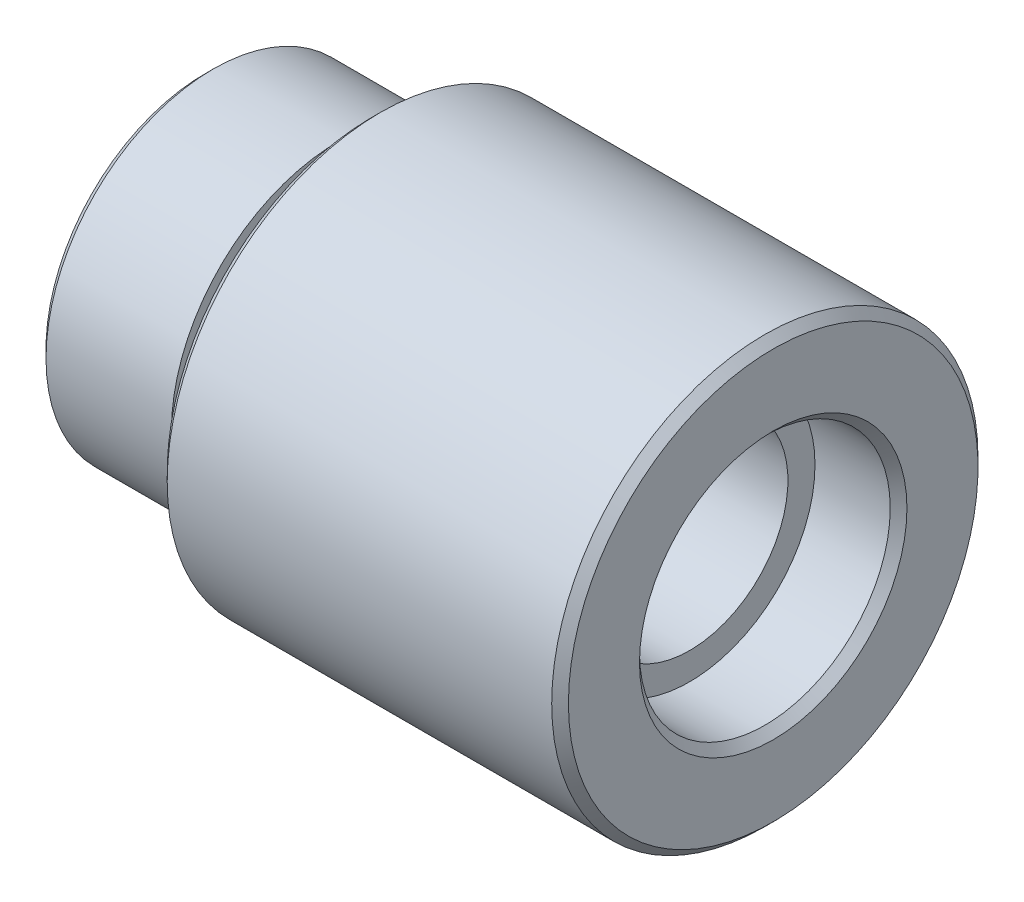
ISO-10303-21;
HEADER;
FILE_DESCRIPTION(('STEP AP214'),'2;1');
FILE_NAME('part.step','',(''),(''),'','','');
FILE_SCHEMA(('AUTOMOTIVE_DESIGN { 1 0 10303 214 1 1 1 1 }'));
ENDSEC;
DATA;
#1=APPLICATION_CONTEXT('core data for automotive mechanical design processes');
#2=APPLICATION_PROTOCOL_DEFINITION('international standard','automotive_design',2000,#1);
#3=PRODUCT_CONTEXT('',#1,'mechanical');
#4=PRODUCT('Part','Part','',(#3));
#5=PRODUCT_RELATED_PRODUCT_CATEGORY('part','',(#4));
#6=PRODUCT_DEFINITION_FORMATION('','',#4);
#7=PRODUCT_DEFINITION_CONTEXT('part definition',#1,'design');
#8=PRODUCT_DEFINITION('design','',#6,#7);
#9=PRODUCT_DEFINITION_SHAPE('','',#8);
#10=(LENGTH_UNIT() NAMED_UNIT(*) SI_UNIT(.MILLI.,.METRE.));
#11=(NAMED_UNIT(*) PLANE_ANGLE_UNIT() SI_UNIT($,.RADIAN.));
#12=(NAMED_UNIT(*) SI_UNIT($,.STERADIAN.) SOLID_ANGLE_UNIT());
#13=UNCERTAINTY_MEASURE_WITH_UNIT(LENGTH_MEASURE(1.E-05),#10,'distance_accuracy_value','');
#14=(GEOMETRIC_REPRESENTATION_CONTEXT(3) GLOBAL_UNCERTAINTY_ASSIGNED_CONTEXT((#13)) GLOBAL_UNIT_ASSIGNED_CONTEXT((#10,
#11,#12)) REPRESENTATION_CONTEXT('',''));
#15=CARTESIAN_POINT('',(0.,0.,0.));
#16=DIRECTION('',(0.,0.,1.));
#17=DIRECTION('',(1.,0.,0.));
#18=AXIS2_PLACEMENT_3D('',#15,#16,#17);
#19=CARTESIAN_POINT('',(0.,10.,0.));
#20=DIRECTION('',(1.,0.,0.));
#21=DIRECTION('',(0.,0.,-1.));
#22=AXIS2_PLACEMENT_3D('',#19,#20,#21);
#23=PLANE('',#22);
#24=CARTESIAN_POINT('',(0.,0.,0.));
#25=DIRECTION('',(1.,0.,0.));
#26=DIRECTION('',(0.,0.,-1.));
#27=AXIS2_PLACEMENT_3D('',#24,#25,#26);
#28=CIRCLE('',#27,9.49999999999999);
#29=CARTESIAN_POINT('',(0.,0.,-9.49999999999999));
#30=VERTEX_POINT('',#29);
#31=EDGE_CURVE('E63',#30,#30,#28,.F.);
#32=ORIENTED_EDGE('',*,*,#31,.T.);
#33=EDGE_LOOP('',(#32));
#34=FACE_BOUND('',#33,.T.);
#35=CARTESIAN_POINT('',(0.,0.,0.));
#36=DIRECTION('',(1.,0.,0.));
#37=DIRECTION('',(0.,0.,-1.));
#38=AXIS2_PLACEMENT_3D('',#35,#36,#37);
#39=CIRCLE('',#38,8.);
#40=CARTESIAN_POINT('',(0.,0.,-8.));
#41=VERTEX_POINT('',#40);
#42=EDGE_CURVE('E66',#41,#41,#39,.T.);
#43=ORIENTED_EDGE('',*,*,#42,.T.);
#44=EDGE_LOOP('',(#43));
#45=FACE_BOUND('',#44,.T.);
#46=ADVANCED_FACE('F32',(#34,#45),#23,.F.);
#47=CARTESIAN_POINT('',(0.,0.,0.));
#48=DIRECTION('',(-1.,0.,0.));
#49=DIRECTION('',(0.,0.,1.));
#50=AXIS2_PLACEMENT_3D('',#47,#48,#49);
#51=CYLINDRICAL_SURFACE('',#50,10.);
#52=CARTESIAN_POINT('',(0.50000000000001,0.,0.));
#53=DIRECTION('',(1.,0.,0.));
#54=DIRECTION('',(0.,0.,-1.));
#55=AXIS2_PLACEMENT_3D('',#52,#53,#54);
#56=CIRCLE('',#55,10.);
#57=CARTESIAN_POINT('',(0.50000000000001,0.,-10.));
#58=VERTEX_POINT('',#57);
#59=EDGE_CURVE('E60',#58,#58,#56,.T.);
#60=ORIENTED_EDGE('',*,*,#59,.T.);
#61=EDGE_LOOP('',(#60));
#62=FACE_BOUND('',#61,.T.);
#63=CARTESIAN_POINT('',(8.,0.,0.));
#64=DIRECTION('',(-1.,0.,0.));
#65=DIRECTION('',(0.,0.,1.));
#66=AXIS2_PLACEMENT_3D('',#63,#64,#65);
#67=CIRCLE('',#66,10.);
#68=CARTESIAN_POINT('',(8.,0.,10.));
#69=VERTEX_POINT('',#68);
#70=EDGE_CURVE('E69',#69,#69,#67,.T.);
#71=ORIENTED_EDGE('',*,*,#70,.T.);
#72=EDGE_LOOP('',(#71));
#73=FACE_BOUND('',#72,.T.);
#74=ADVANCED_FACE('F108',(#62,#73),#51,.T.);
#75=CARTESIAN_POINT('',(8.,9.24999999999999,0.));
#76=DIRECTION('',(-1.,0.,0.));
#77=DIRECTION('',(0.,0.,1.));
#78=AXIS2_PLACEMENT_3D('',#75,#76,#77);
#79=PLANE('',#78);
#80=ORIENTED_EDGE('',*,*,#70,.F.);
#81=EDGE_LOOP('',(#80));
#82=FACE_BOUND('',#81,.T.);
#83=CARTESIAN_POINT('',(8.,0.,0.));
#84=DIRECTION('',(-1.,0.,0.));
#85=DIRECTION('',(0.,0.,1.));
#86=AXIS2_PLACEMENT_3D('',#83,#84,#85);
#87=CIRCLE('',#86,9.24999999999999);
#88=CARTESIAN_POINT('',(8.,0.,9.24999999999999));
#89=VERTEX_POINT('',#88);
#90=EDGE_CURVE('E72',#89,#89,#87,.T.);
#91=ORIENTED_EDGE('',*,*,#90,.T.);
#92=EDGE_LOOP('',(#91));
#93=FACE_BOUND('',#92,.T.);
#94=ADVANCED_FACE('F113',(#82,#93),#79,.F.);
#95=CARTESIAN_POINT('',(0.,0.,0.));
#96=DIRECTION('',(-1.,0.,0.));
#97=DIRECTION('',(0.,0.,1.));
#98=AXIS2_PLACEMENT_3D('',#95,#96,#97);
#99=CYLINDRICAL_SURFACE('',#98,9.24999999999999);
#100=ORIENTED_EDGE('',*,*,#90,.F.);
#101=EDGE_LOOP('',(#100));
#102=FACE_BOUND('',#101,.T.);
#103=CARTESIAN_POINT('',(10.,0.,0.));
#104=DIRECTION('',(-1.,0.,0.));
#105=DIRECTION('',(0.,0.,1.));
#106=AXIS2_PLACEMENT_3D('',#103,#104,#105);
#107=CIRCLE('',#106,9.24999999999999);
#108=CARTESIAN_POINT('',(10.,0.,9.24999999999999));
#109=VERTEX_POINT('',#108);
#110=EDGE_CURVE('E75',#109,#109,#107,.T.);
#111=ORIENTED_EDGE('',*,*,#110,.T.);
#112=EDGE_LOOP('',(#111));
#113=FACE_BOUND('',#112,.T.);
#114=ADVANCED_FACE('F154',(#102,#113),#99,.T.);
#115=CARTESIAN_POINT('',(10.,12.75,0.));
#116=DIRECTION('',(1.,0.,0.));
#117=DIRECTION('',(0.,0.,-1.));
#118=AXIS2_PLACEMENT_3D('',#115,#116,#117);
#119=PLANE('',#118);
#120=CARTESIAN_POINT('',(10.,0.,0.));
#121=DIRECTION('',(1.,0.,0.));
#122=DIRECTION('',(0.,0.,-1.));
#123=AXIS2_PLACEMENT_3D('',#120,#121,#122);
#124=CIRCLE('',#123,12.25);
#125=CARTESIAN_POINT('',(10.,0.,-12.25));
#126=VERTEX_POINT('',#125);
#127=EDGE_CURVE('E42',#126,#126,#124,.F.);
#128=ORIENTED_EDGE('',*,*,#127,.T.);
#129=EDGE_LOOP('',(#128));
#130=FACE_BOUND('',#129,.T.);
#131=ORIENTED_EDGE('',*,*,#110,.F.);
#132=EDGE_LOOP('',(#131));
#133=FACE_BOUND('',#132,.T.);
#134=ADVANCED_FACE('F146',(#130,#133),#119,.F.);
#135=CARTESIAN_POINT('',(0.,0.,0.));
#136=DIRECTION('',(-1.,0.,0.));
#137=DIRECTION('',(0.,0.,1.));
#138=AXIS2_PLACEMENT_3D('',#135,#136,#137);
#139=CYLINDRICAL_SURFACE('',#138,12.75);
#140=CARTESIAN_POINT('',(33.5,0.,0.));
#141=DIRECTION('',(-1.,0.,0.));
#142=DIRECTION('',(0.,0.,1.));
#143=AXIS2_PLACEMENT_3D('',#140,#141,#142);
#144=CIRCLE('',#143,12.75);
#145=CARTESIAN_POINT('',(33.5,0.,12.75));
#146=VERTEX_POINT('',#145);
#147=EDGE_CURVE('E54',#146,#146,#144,.T.);
#148=ORIENTED_EDGE('',*,*,#147,.T.);
#149=EDGE_LOOP('',(#148));
#150=FACE_BOUND('',#149,.T.);
#151=CARTESIAN_POINT('',(10.5,0.,0.));
#152=DIRECTION('',(1.,0.,0.));
#153=DIRECTION('',(0.,0.,-1.));
#154=AXIS2_PLACEMENT_3D('',#151,#152,#153);
#155=CIRCLE('',#154,12.75);
#156=CARTESIAN_POINT('',(10.5,0.,-12.75));
#157=VERTEX_POINT('',#156);
#158=EDGE_CURVE('E57',#157,#157,#155,.T.);
#159=ORIENTED_EDGE('',*,*,#158,.T.);
#160=EDGE_LOOP('',(#159));
#161=FACE_BOUND('',#160,.T.);
#162=ADVANCED_FACE('F142',(#150,#161),#139,.T.);
#163=CARTESIAN_POINT('',(34.,7.5,0.));
#164=DIRECTION('',(-1.,0.,0.));
#165=DIRECTION('',(0.,0.,1.));
#166=AXIS2_PLACEMENT_3D('',#163,#164,#165);
#167=PLANE('',#166);
#168=CARTESIAN_POINT('',(34.,0.,0.));
#169=DIRECTION('',(-1.,0.,0.));
#170=DIRECTION('',(0.,0.,1.));
#171=AXIS2_PLACEMENT_3D('',#168,#169,#170);
#172=CIRCLE('',#171,12.25);
#173=CARTESIAN_POINT('',(34.,0.,12.25));
#174=VERTEX_POINT('',#173);
#175=EDGE_CURVE('E46',#174,#174,#172,.F.);
#176=ORIENTED_EDGE('',*,*,#175,.T.);
#177=EDGE_LOOP('',(#176));
#178=FACE_BOUND('',#177,.T.);
#179=CARTESIAN_POINT('',(34.,0.,0.));
#180=DIRECTION('',(-1.,0.,0.));
#181=DIRECTION('',(0.,0.,1.));
#182=AXIS2_PLACEMENT_3D('',#179,#180,#181);
#183=CIRCLE('',#182,8.00000000000001);
#184=CARTESIAN_POINT('',(34.,0.,8.00000000000001));
#185=VERTEX_POINT('',#184);
#186=EDGE_CURVE('E51',#185,#185,#183,.T.);
#187=ORIENTED_EDGE('',*,*,#186,.T.);
#188=EDGE_LOOP('',(#187));
#189=FACE_BOUND('',#188,.T.);
#190=ADVANCED_FACE('F145',(#178,#189),#167,.F.);
#191=CARTESIAN_POINT('',(0.,0.,0.));
#192=DIRECTION('',(-1.,0.,0.));
#193=DIRECTION('',(0.,0.,1.));
#194=AXIS2_PLACEMENT_3D('',#191,#192,#193);
#195=CYLINDRICAL_SURFACE('',#194,7.5);
#196=CARTESIAN_POINT('',(33.5,0.,0.));
#197=DIRECTION('',(-1.,0.,0.));
#198=DIRECTION('',(0.,0.,1.));
#199=AXIS2_PLACEMENT_3D('',#196,#197,#198);
#200=CIRCLE('',#199,7.5);
#201=CARTESIAN_POINT('',(33.5,0.,7.5));
#202=VERTEX_POINT('',#201);
#203=EDGE_CURVE('E38',#202,#202,#200,.F.);
#204=ORIENTED_EDGE('',*,*,#203,.T.);
#205=EDGE_LOOP('',(#204));
#206=FACE_BOUND('',#205,.T.);
#207=CARTESIAN_POINT('',(29.,0.,0.));
#208=DIRECTION('',(-1.,0.,0.));
#209=DIRECTION('',(0.,0.,1.));
#210=AXIS2_PLACEMENT_3D('',#207,#208,#209);
#211=CIRCLE('',#210,7.5);
#212=CARTESIAN_POINT('',(29.,0.,7.5));
#213=VERTEX_POINT('',#212);
#214=EDGE_CURVE('E78',#213,#213,#211,.T.);
#215=ORIENTED_EDGE('',*,*,#214,.T.);
#216=EDGE_LOOP('',(#215));
#217=FACE_BOUND('',#216,.T.);
#218=ADVANCED_FACE('F170',(#206,#217),#195,.F.);
#219=CARTESIAN_POINT('',(29.,5.88,0.));
#220=DIRECTION('',(-1.,0.,0.));
#221=DIRECTION('',(0.,0.,1.));
#222=AXIS2_PLACEMENT_3D('',#219,#220,#221);
#223=PLANE('',#222);
#224=ORIENTED_EDGE('',*,*,#214,.F.);
#225=EDGE_LOOP('',(#224));
#226=FACE_BOUND('',#225,.T.);
#227=CARTESIAN_POINT('',(29.,0.,0.));
#228=DIRECTION('',(-1.,0.,0.));
#229=DIRECTION('',(0.,0.,1.));
#230=AXIS2_PLACEMENT_3D('',#227,#228,#229);
#231=CIRCLE('',#230,5.88);
#232=CARTESIAN_POINT('',(29.,0.,5.88));
#233=VERTEX_POINT('',#232);
#234=EDGE_CURVE('E81',#233,#233,#231,.T.);
#235=ORIENTED_EDGE('',*,*,#234,.T.);
#236=EDGE_LOOP('',(#235));
#237=FACE_BOUND('',#236,.T.);
#238=ADVANCED_FACE('F174',(#226,#237),#223,.F.);
#239=CARTESIAN_POINT('',(0.,0.,0.));
#240=DIRECTION('',(-1.,0.,0.));
#241=DIRECTION('',(0.,0.,1.));
#242=AXIS2_PLACEMENT_3D('',#239,#240,#241);
#243=CYLINDRICAL_SURFACE('',#242,5.88);
#244=ORIENTED_EDGE('',*,*,#234,.F.);
#245=EDGE_LOOP('',(#244));
#246=FACE_BOUND('',#245,.T.);
#247=CARTESIAN_POINT('',(5.,0.,0.));
#248=DIRECTION('',(-1.,0.,0.));
#249=DIRECTION('',(0.,0.,1.));
#250=AXIS2_PLACEMENT_3D('',#247,#248,#249);
#251=CIRCLE('',#250,5.88);
#252=CARTESIAN_POINT('',(5.,0.,5.88));
#253=VERTEX_POINT('',#252);
#254=EDGE_CURVE('E84',#253,#253,#251,.T.);
#255=ORIENTED_EDGE('',*,*,#254,.T.);
#256=EDGE_LOOP('',(#255));
#257=FACE_BOUND('',#256,.T.);
#258=ADVANCED_FACE('F104',(#246,#257),#243,.F.);
#259=CARTESIAN_POINT('',(5.,7.5,0.));
#260=DIRECTION('',(1.,0.,0.));
#261=DIRECTION('',(0.,0.,-1.));
#262=AXIS2_PLACEMENT_3D('',#259,#260,#261);
#263=PLANE('',#262);
#264=ORIENTED_EDGE('',*,*,#254,.F.);
#265=EDGE_LOOP('',(#264));
#266=FACE_BOUND('',#265,.T.);
#267=CARTESIAN_POINT('',(5.,0.,0.));
#268=DIRECTION('',(-1.,0.,0.));
#269=DIRECTION('',(0.,0.,1.));
#270=AXIS2_PLACEMENT_3D('',#267,#268,#269);
#271=CIRCLE('',#270,7.5);
#272=CARTESIAN_POINT('',(5.,0.,7.5));
#273=VERTEX_POINT('',#272);
#274=EDGE_CURVE('E87',#273,#273,#271,.T.);
#275=ORIENTED_EDGE('',*,*,#274,.T.);
#276=EDGE_LOOP('',(#275));
#277=FACE_BOUND('',#276,.T.);
#278=ADVANCED_FACE('F91',(#266,#277),#263,.F.);
#279=CARTESIAN_POINT('',(0.,0.,0.));
#280=DIRECTION('',(-1.,0.,0.));
#281=DIRECTION('',(0.,0.,1.));
#282=AXIS2_PLACEMENT_3D('',#279,#280,#281);
#283=CYLINDRICAL_SURFACE('',#282,7.5);
#284=CARTESIAN_POINT('',(0.50000000000001,0.,0.));
#285=DIRECTION('',(1.,0.,0.));
#286=DIRECTION('',(0.,0.,-1.));
#287=AXIS2_PLACEMENT_3D('',#284,#285,#286);
#288=CIRCLE('',#287,7.5);
#289=CARTESIAN_POINT('',(0.50000000000001,0.,-7.5));
#290=VERTEX_POINT('',#289);
#291=EDGE_CURVE('E10',#290,#290,#288,.F.);
#292=ORIENTED_EDGE('',*,*,#291,.T.);
#293=EDGE_LOOP('',(#292));
#294=FACE_BOUND('',#293,.T.);
#295=ORIENTED_EDGE('',*,*,#274,.F.);
#296=EDGE_LOOP('',(#295));
#297=FACE_BOUND('',#296,.T.);
#298=ADVANCED_FACE('F93',(#294,#297),#283,.F.);
#299=CARTESIAN_POINT('',(0.,0.,0.));
#300=DIRECTION('',(1.,0.,0.));
#301=DIRECTION('',(0.,0.,-1.));
#302=AXIS2_PLACEMENT_3D('',#299,#300,#301);
#303=CONICAL_SURFACE('',#302,9.49999999999999,0.785398163397443);
#304=ORIENTED_EDGE('',*,*,#59,.F.);
#305=EDGE_LOOP('',(#304));
#306=FACE_BOUND('',#305,.T.);
#307=ORIENTED_EDGE('',*,*,#31,.F.);
#308=EDGE_LOOP('',(#307));
#309=FACE_BOUND('',#308,.T.);
#310=ADVANCED_FACE('F95',(#306,#309),#303,.T.);
#311=CARTESIAN_POINT('',(33.5,0.,0.));
#312=DIRECTION('',(-1.,0.,0.));
#313=DIRECTION('',(0.,0.,1.));
#314=AXIS2_PLACEMENT_3D('',#311,#312,#313);
#315=CONICAL_SURFACE('',#314,12.75,0.785398163397445);
#316=ORIENTED_EDGE('',*,*,#175,.F.);
#317=EDGE_LOOP('',(#316));
#318=FACE_BOUND('',#317,.T.);
#319=ORIENTED_EDGE('',*,*,#147,.F.);
#320=EDGE_LOOP('',(#319));
#321=FACE_BOUND('',#320,.T.);
#322=ADVANCED_FACE('F101',(#318,#321),#315,.T.);
#323=CARTESIAN_POINT('',(10.,0.,0.));
#324=DIRECTION('',(1.,0.,0.));
#325=DIRECTION('',(0.,0.,-1.));
#326=AXIS2_PLACEMENT_3D('',#323,#324,#325);
#327=CONICAL_SURFACE('',#326,12.25,0.785398163397453);
#328=ORIENTED_EDGE('',*,*,#158,.F.);
#329=EDGE_LOOP('',(#328));
#330=FACE_BOUND('',#329,.T.);
#331=ORIENTED_EDGE('',*,*,#127,.F.);
#332=EDGE_LOOP('',(#331));
#333=FACE_BOUND('',#332,.T.);
#334=ADVANCED_FACE('F127',(#330,#333),#327,.T.);
#335=CARTESIAN_POINT('',(34.,0.,0.));
#336=DIRECTION('',(1.,0.,0.));
#337=DIRECTION('',(0.,0.,-1.));
#338=AXIS2_PLACEMENT_3D('',#335,#336,#337);
#339=CONICAL_SURFACE('',#338,8.00000000000001,0.785398163397457);
#340=ORIENTED_EDGE('',*,*,#203,.F.);
#341=EDGE_LOOP('',(#340));
#342=FACE_BOUND('',#341,.T.);
#343=ORIENTED_EDGE('',*,*,#186,.F.);
#344=EDGE_LOOP('',(#343));
#345=FACE_BOUND('',#344,.T.);
#346=ADVANCED_FACE('F122',(#342,#345),#339,.F.);
#347=CARTESIAN_POINT('',(0.50000000000001,0.,0.));
#348=DIRECTION('',(-1.,0.,0.));
#349=DIRECTION('',(0.,0.,1.));
#350=AXIS2_PLACEMENT_3D('',#347,#348,#349);
#351=CONICAL_SURFACE('',#350,7.5,0.785398163397443);
#352=ORIENTED_EDGE('',*,*,#42,.F.);
#353=EDGE_LOOP('',(#352));
#354=FACE_BOUND('',#353,.T.);
#355=ORIENTED_EDGE('',*,*,#291,.F.);
#356=EDGE_LOOP('',(#355));
#357=FACE_BOUND('',#356,.T.);
#358=ADVANCED_FACE('F119',(#354,#357),#351,.F.);
#359=CLOSED_SHELL('',(#46,#74,#94,#114,#134,#162,#190,#218,#238,#258,#278,#298,#310,#322,#334,
#346,#358));
#360=MANIFOLD_SOLID_BREP('B2',#359);
#361=ADVANCED_BREP_SHAPE_REPRESENTATION('',(#18,#360),#14);
#362=SHAPE_DEFINITION_REPRESENTATION(#9,#361);
ENDSEC;
END-ISO-10303-21;
